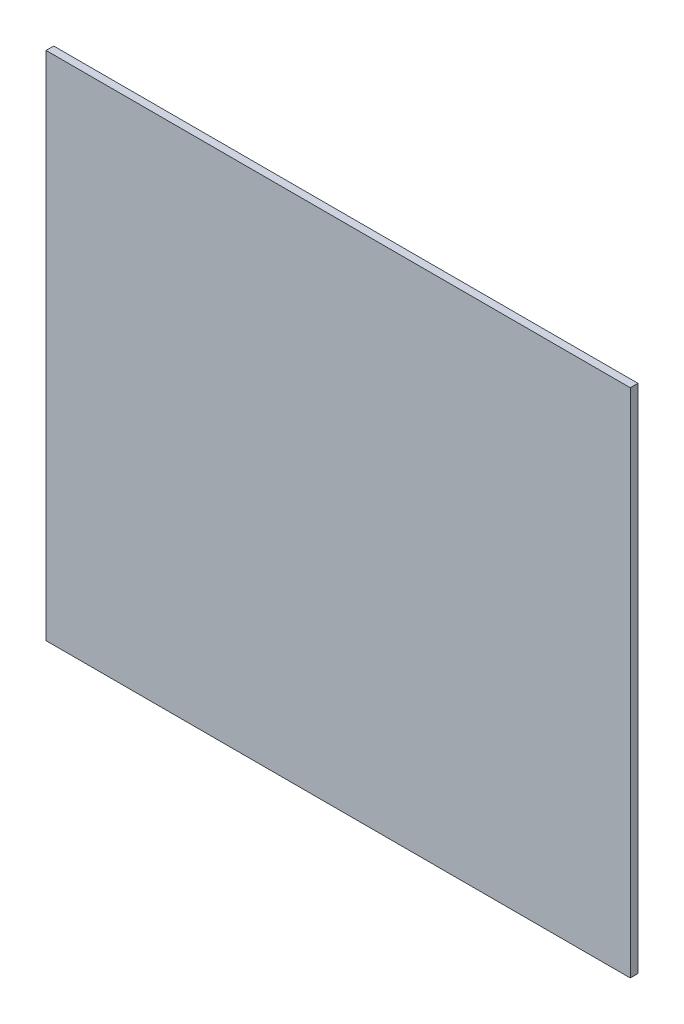
ISO-10303-21;
HEADER;
FILE_DESCRIPTION(('STEP AP214'),'2;1');
FILE_NAME('part.step','',(''),(''),'','','');
FILE_SCHEMA(('AUTOMOTIVE_DESIGN { 1 0 10303 214 1 1 1 1 }'));
ENDSEC;
DATA;
#1=APPLICATION_CONTEXT('core data for automotive mechanical design processes');
#2=APPLICATION_PROTOCOL_DEFINITION('international standard','automotive_design',2000,#1);
#3=PRODUCT_CONTEXT('',#1,'mechanical');
#4=PRODUCT('Part','Part','',(#3));
#5=PRODUCT_RELATED_PRODUCT_CATEGORY('part','',(#4));
#6=PRODUCT_DEFINITION_FORMATION('','',#4);
#7=PRODUCT_DEFINITION_CONTEXT('part definition',#1,'design');
#8=PRODUCT_DEFINITION('design','',#6,#7);
#9=PRODUCT_DEFINITION_SHAPE('','',#8);
#10=(LENGTH_UNIT() NAMED_UNIT(*) SI_UNIT(.MILLI.,.METRE.));
#11=(NAMED_UNIT(*) PLANE_ANGLE_UNIT() SI_UNIT($,.RADIAN.));
#12=(NAMED_UNIT(*) SI_UNIT($,.STERADIAN.) SOLID_ANGLE_UNIT());
#13=UNCERTAINTY_MEASURE_WITH_UNIT(LENGTH_MEASURE(1.E-05),#10,'distance_accuracy_value','');
#14=(GEOMETRIC_REPRESENTATION_CONTEXT(3) GLOBAL_UNCERTAINTY_ASSIGNED_CONTEXT((#13)) GLOBAL_UNIT_ASSIGNED_CONTEXT((#10,
#11,#12)) REPRESENTATION_CONTEXT('',''));
#15=CARTESIAN_POINT('',(0.,0.,0.));
#16=DIRECTION('',(0.,0.,1.));
#17=DIRECTION('',(1.,0.,0.));
#18=AXIS2_PLACEMENT_3D('',#15,#16,#17);
#19=CARTESIAN_POINT('',(101.6,-88.9,2.667));
#20=DIRECTION('',(-1.,0.,0.));
#21=DIRECTION('',(0.,0.,1.));
#22=AXIS2_PLACEMENT_3D('',#19,#20,#21);
#23=PLANE('',#22);
#24=DIRECTION('',(0.,1.,0.));
#25=VECTOR('',#24,1.);
#26=CARTESIAN_POINT('',(101.6,-88.9,0.));
#27=LINE('',#26,#25);
#28=CARTESIAN_POINT('',(101.6,-88.9,0.));
#29=VERTEX_POINT('',#28);
#30=CARTESIAN_POINT('',(101.6,88.9,0.));
#31=VERTEX_POINT('',#30);
#32=EDGE_CURVE('E106',#29,#31,#27,.T.);
#33=ORIENTED_EDGE('',*,*,#32,.T.);
#34=DIRECTION('',(0.,0.,-1.));
#35=VECTOR('',#34,1.);
#36=CARTESIAN_POINT('',(101.6,88.9,2.667));
#37=LINE('',#36,#35);
#38=CARTESIAN_POINT('',(101.6,88.9,2.667));
#39=VERTEX_POINT('',#38);
#40=EDGE_CURVE('E11',#39,#31,#37,.T.);
#41=ORIENTED_EDGE('',*,*,#40,.F.);
#42=DIRECTION('',(0.,1.,0.));
#43=VECTOR('',#42,1.);
#44=CARTESIAN_POINT('',(101.6,-88.9,2.667));
#45=LINE('',#44,#43);
#46=CARTESIAN_POINT('',(101.6,-88.9,2.667));
#47=VERTEX_POINT('',#46);
#48=EDGE_CURVE('E94',#47,#39,#45,.T.);
#49=ORIENTED_EDGE('',*,*,#48,.F.);
#50=DIRECTION('',(0.,0.,-1.));
#51=VECTOR('',#50,1.);
#52=CARTESIAN_POINT('',(101.6,-88.9,2.667));
#53=LINE('',#52,#51);
#54=EDGE_CURVE('E102',#47,#29,#53,.T.);
#55=ORIENTED_EDGE('',*,*,#54,.T.);
#56=EDGE_LOOP('',(#33,#41,#49,#55));
#57=FACE_BOUND('',#56,.T.);
#58=ADVANCED_FACE('F43',(#57),#23,.F.);
#59=CARTESIAN_POINT('',(-101.6,88.9,2.667));
#60=DIRECTION('',(0.,-1.,0.));
#61=DIRECTION('',(0.,0.,-1.));
#62=AXIS2_PLACEMENT_3D('',#59,#60,#61);
#63=PLANE('',#62);
#64=DIRECTION('',(-1.,0.,0.));
#65=VECTOR('',#64,1.);
#66=CARTESIAN_POINT('',(-101.6,88.9,0.));
#67=LINE('',#66,#65);
#68=CARTESIAN_POINT('',(-101.6,88.9,0.));
#69=VERTEX_POINT('',#68);
#70=EDGE_CURVE('E98',#31,#69,#67,.T.);
#71=ORIENTED_EDGE('',*,*,#70,.T.);
#72=DIRECTION('',(0.,0.,-1.));
#73=VECTOR('',#72,1.);
#74=CARTESIAN_POINT('',(-101.6,88.9,2.667));
#75=LINE('',#74,#73);
#76=CARTESIAN_POINT('',(-101.6,88.9,2.667));
#77=VERTEX_POINT('',#76);
#78=EDGE_CURVE('E51',#77,#69,#75,.T.);
#79=ORIENTED_EDGE('',*,*,#78,.F.);
#80=DIRECTION('',(-1.,0.,0.));
#81=VECTOR('',#80,1.);
#82=CARTESIAN_POINT('',(-101.6,88.9,2.667));
#83=LINE('',#82,#81);
#84=EDGE_CURVE('E89',#39,#77,#83,.T.);
#85=ORIENTED_EDGE('',*,*,#84,.F.);
#86=ORIENTED_EDGE('',*,*,#40,.T.);
#87=EDGE_LOOP('',(#71,#79,#85,#86));
#88=FACE_BOUND('',#87,.T.);
#89=ADVANCED_FACE('F97',(#88),#63,.F.);
#90=CARTESIAN_POINT('',(-101.6,-88.9,2.667));
#91=DIRECTION('',(1.,0.,0.));
#92=DIRECTION('',(0.,0.,-1.));
#93=AXIS2_PLACEMENT_3D('',#90,#91,#92);
#94=PLANE('',#93);
#95=DIRECTION('',(0.,-1.,0.));
#96=VECTOR('',#95,1.);
#97=CARTESIAN_POINT('',(-101.6,-88.9,0.));
#98=LINE('',#97,#96);
#99=CARTESIAN_POINT('',(-101.6,-88.9,0.));
#100=VERTEX_POINT('',#99);
#101=EDGE_CURVE('E76',#69,#100,#98,.T.);
#102=ORIENTED_EDGE('',*,*,#101,.T.);
#103=DIRECTION('',(0.,0.,-1.));
#104=VECTOR('',#103,1.);
#105=CARTESIAN_POINT('',(-101.6,-88.9,2.667));
#106=LINE('',#105,#104);
#107=CARTESIAN_POINT('',(-101.6,-88.9,2.667));
#108=VERTEX_POINT('',#107);
#109=EDGE_CURVE('E99',#108,#100,#106,.T.);
#110=ORIENTED_EDGE('',*,*,#109,.F.);
#111=DIRECTION('',(0.,-1.,0.));
#112=VECTOR('',#111,1.);
#113=CARTESIAN_POINT('',(-101.6,-88.9,2.667));
#114=LINE('',#113,#112);
#115=EDGE_CURVE('E92',#77,#108,#114,.T.);
#116=ORIENTED_EDGE('',*,*,#115,.F.);
#117=ORIENTED_EDGE('',*,*,#78,.T.);
#118=EDGE_LOOP('',(#102,#110,#116,#117));
#119=FACE_BOUND('',#118,.T.);
#120=ADVANCED_FACE('F100',(#119),#94,.F.);
#121=CARTESIAN_POINT('',(-101.6,-88.9,2.667));
#122=DIRECTION('',(0.,1.,0.));
#123=DIRECTION('',(0.,0.,1.));
#124=AXIS2_PLACEMENT_3D('',#121,#122,#123);
#125=PLANE('',#124);
#126=DIRECTION('',(1.,0.,0.));
#127=VECTOR('',#126,1.);
#128=CARTESIAN_POINT('',(-101.6,-88.9,0.));
#129=LINE('',#128,#127);
#130=EDGE_CURVE('E82',#100,#29,#129,.T.);
#131=ORIENTED_EDGE('',*,*,#130,.T.);
#132=ORIENTED_EDGE('',*,*,#54,.F.);
#133=DIRECTION('',(1.,0.,0.));
#134=VECTOR('',#133,1.);
#135=CARTESIAN_POINT('',(-101.6,-88.9,2.667));
#136=LINE('',#135,#134);
#137=EDGE_CURVE('E59',#108,#47,#136,.T.);
#138=ORIENTED_EDGE('',*,*,#137,.F.);
#139=ORIENTED_EDGE('',*,*,#109,.T.);
#140=EDGE_LOOP('',(#131,#132,#138,#139));
#141=FACE_BOUND('',#140,.T.);
#142=ADVANCED_FACE('F113',(#141),#125,.F.);
#143=CARTESIAN_POINT('',(0.,0.,2.667));
#144=DIRECTION('',(0.,0.,-1.));
#145=DIRECTION('',(-1.,0.,0.));
#146=AXIS2_PLACEMENT_3D('',#143,#144,#145);
#147=PLANE('',#146);
#148=ORIENTED_EDGE('',*,*,#48,.T.);
#149=ORIENTED_EDGE('',*,*,#84,.T.);
#150=ORIENTED_EDGE('',*,*,#115,.T.);
#151=ORIENTED_EDGE('',*,*,#137,.T.);
#152=EDGE_LOOP('',(#148,#149,#150,#151));
#153=FACE_BOUND('',#152,.T.);
#154=ADVANCED_FACE('F90',(#153),#147,.F.);
#155=CARTESIAN_POINT('',(0.,0.,0.));
#156=DIRECTION('',(0.,0.,-1.));
#157=DIRECTION('',(-1.,0.,0.));
#158=AXIS2_PLACEMENT_3D('',#155,#156,#157);
#159=PLANE('',#158);
#160=ORIENTED_EDGE('',*,*,#32,.F.);
#161=ORIENTED_EDGE('',*,*,#130,.F.);
#162=ORIENTED_EDGE('',*,*,#101,.F.);
#163=ORIENTED_EDGE('',*,*,#70,.F.);
#164=EDGE_LOOP('',(#160,#161,#162,#163));
#165=FACE_BOUND('',#164,.T.);
#166=ADVANCED_FACE('F116',(#165),#159,.T.);
#167=CLOSED_SHELL('',(#58,#89,#120,#142,#154,#166));
#168=MANIFOLD_SOLID_BREP('B2',#167);
#169=ADVANCED_BREP_SHAPE_REPRESENTATION('',(#18,#168),#14);
#170=SHAPE_DEFINITION_REPRESENTATION(#9,#169);
ENDSEC;
END-ISO-10303-21;
